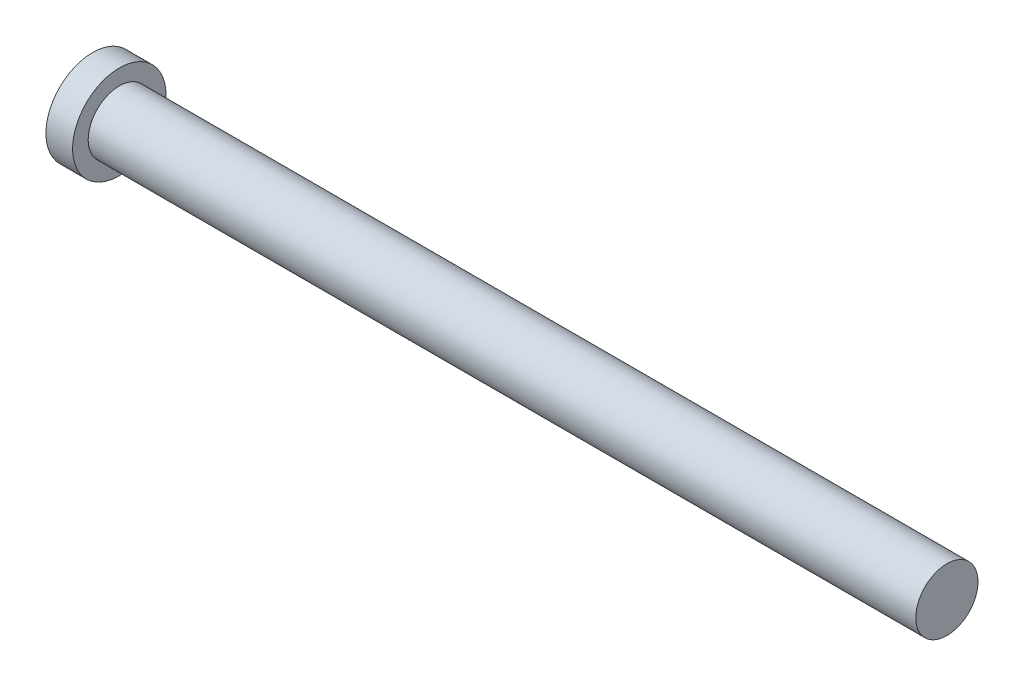
ISO-10303-21;
HEADER;
FILE_DESCRIPTION(('STEP AP214'),'2;1');
FILE_NAME('part.step','',(''),(''),'','','');
FILE_SCHEMA(('AUTOMOTIVE_DESIGN { 1 0 10303 214 1 1 1 1 }'));
ENDSEC;
DATA;
#1=APPLICATION_CONTEXT('core data for automotive mechanical design processes');
#2=APPLICATION_PROTOCOL_DEFINITION('international standard','automotive_design',2000,#1);
#3=PRODUCT_CONTEXT('',#1,'mechanical');
#4=PRODUCT('Part','Part','',(#3));
#5=PRODUCT_RELATED_PRODUCT_CATEGORY('part','',(#4));
#6=PRODUCT_DEFINITION_FORMATION('','',#4);
#7=PRODUCT_DEFINITION_CONTEXT('part definition',#1,'design');
#8=PRODUCT_DEFINITION('design','',#6,#7);
#9=PRODUCT_DEFINITION_SHAPE('','',#8);
#10=(LENGTH_UNIT() NAMED_UNIT(*) SI_UNIT(.MILLI.,.METRE.));
#11=(NAMED_UNIT(*) PLANE_ANGLE_UNIT() SI_UNIT($,.RADIAN.));
#12=(NAMED_UNIT(*) SI_UNIT($,.STERADIAN.) SOLID_ANGLE_UNIT());
#13=UNCERTAINTY_MEASURE_WITH_UNIT(LENGTH_MEASURE(1.E-05),#10,'distance_accuracy_value','');
#14=(GEOMETRIC_REPRESENTATION_CONTEXT(3) GLOBAL_UNCERTAINTY_ASSIGNED_CONTEXT((#13)) GLOBAL_UNIT_ASSIGNED_CONTEXT((#10,
#11,#12)) REPRESENTATION_CONTEXT('',''));
#15=CARTESIAN_POINT('',(0.,0.,0.));
#16=DIRECTION('',(0.,0.,1.));
#17=DIRECTION('',(1.,0.,0.));
#18=AXIS2_PLACEMENT_3D('',#15,#16,#17);
#19=CARTESIAN_POINT('',(3.,0.,0.));
#20=DIRECTION('',(1.,0.,0.));
#21=DIRECTION('',(0.,0.,-1.));
#22=AXIS2_PLACEMENT_3D('',#19,#20,#21);
#23=PLANE('',#22);
#24=CARTESIAN_POINT('',(3.,0.,0.));
#25=DIRECTION('',(1.,0.,0.));
#26=DIRECTION('',(0.,0.,-1.));
#27=AXIS2_PLACEMENT_3D('',#24,#25,#26);
#28=CIRCLE('',#27,5.25);
#29=CARTESIAN_POINT('',(3.,0.,-5.25));
#30=VERTEX_POINT('',#29);
#31=EDGE_CURVE('E10',#30,#30,#28,.T.);
#32=ORIENTED_EDGE('',*,*,#31,.T.);
#33=EDGE_LOOP('',(#32));
#34=FACE_BOUND('',#33,.T.);
#35=CARTESIAN_POINT('',(3.,0.,0.));
#36=DIRECTION('',(1.,0.,0.));
#37=DIRECTION('',(0.,0.,-1.));
#38=AXIS2_PLACEMENT_3D('',#35,#36,#37);
#39=CIRCLE('',#38,3.5);
#40=CARTESIAN_POINT('',(2.99999999999999,0.,3.5));
#41=VERTEX_POINT('',#40);
#42=EDGE_CURVE('E43',#41,#41,#39,.T.);
#43=ORIENTED_EDGE('',*,*,#42,.F.);
#44=EDGE_LOOP('',(#43));
#45=FACE_BOUND('',#44,.T.);
#46=ADVANCED_FACE('F30',(#34,#45),#23,.T.);
#47=CARTESIAN_POINT('',(3.,0.,0.));
#48=DIRECTION('',(-1.,0.,0.));
#49=DIRECTION('',(0.,0.,1.));
#50=AXIS2_PLACEMENT_3D('',#47,#48,#49);
#51=CYLINDRICAL_SURFACE('',#50,5.25);
#52=ORIENTED_EDGE('',*,*,#31,.F.);
#53=EDGE_LOOP('',(#52));
#54=FACE_BOUND('',#53,.T.);
#55=CARTESIAN_POINT('',(0.,0.,0.));
#56=DIRECTION('',(1.,0.,0.));
#57=DIRECTION('',(0.,0.,-1.));
#58=AXIS2_PLACEMENT_3D('',#55,#56,#57);
#59=CIRCLE('',#58,5.25);
#60=CARTESIAN_POINT('',(0.,0.,-5.25));
#61=VERTEX_POINT('',#60);
#62=EDGE_CURVE('E34',#61,#61,#59,.T.);
#63=ORIENTED_EDGE('',*,*,#62,.T.);
#64=EDGE_LOOP('',(#63));
#65=FACE_BOUND('',#64,.T.);
#66=ADVANCED_FACE('F32',(#54,#65),#51,.T.);
#67=CARTESIAN_POINT('',(0.,0.,0.));
#68=DIRECTION('',(1.,0.,0.));
#69=DIRECTION('',(0.,0.,-1.));
#70=AXIS2_PLACEMENT_3D('',#67,#68,#69);
#71=PLANE('',#70);
#72=ORIENTED_EDGE('',*,*,#62,.F.);
#73=EDGE_LOOP('',(#72));
#74=FACE_BOUND('',#73,.T.);
#75=ADVANCED_FACE('F54',(#74),#71,.F.);
#76=CARTESIAN_POINT('',(96.,0.,0.));
#77=DIRECTION('',(-1.,0.,0.));
#78=DIRECTION('',(0.,0.,1.));
#79=AXIS2_PLACEMENT_3D('',#76,#77,#78);
#80=CYLINDRICAL_SURFACE('',#79,3.5);
#81=CARTESIAN_POINT('',(96.,0.,0.));
#82=DIRECTION('',(1.,0.,0.));
#83=DIRECTION('',(0.,0.,-1.));
#84=AXIS2_PLACEMENT_3D('',#81,#82,#83);
#85=CIRCLE('',#84,3.5);
#86=CARTESIAN_POINT('',(96.,0.,3.5));
#87=VERTEX_POINT('',#86);
#88=EDGE_CURVE('E41',#87,#87,#85,.T.);
#89=CARTESIAN_POINT('',(96.,0.,3.5));
#90=CARTESIAN_POINT('',(95.03125,0.,3.5));
#91=CARTESIAN_POINT('',(94.0625,0.,3.5));
#92=CARTESIAN_POINT('',(92.125,0.,3.5));
#93=CARTESIAN_POINT('',(91.15625,0.,3.5));
#94=CARTESIAN_POINT('',(89.21875,0.,3.5));
#95=CARTESIAN_POINT('',(88.25,0.,3.5));
#96=CARTESIAN_POINT('',(86.3125,0.,3.5));
#97=CARTESIAN_POINT('',(85.34375,0.,3.5));
#98=CARTESIAN_POINT('',(83.40625,0.,3.5));
#99=CARTESIAN_POINT('',(82.4375,0.,3.5));
#100=CARTESIAN_POINT('',(80.5,0.,3.5));
#101=CARTESIAN_POINT('',(79.53125,0.,3.5));
#102=CARTESIAN_POINT('',(77.59375,0.,3.5));
#103=CARTESIAN_POINT('',(76.625,0.,3.5));
#104=CARTESIAN_POINT('',(74.6875,0.,3.5));
#105=CARTESIAN_POINT('',(73.71875,0.,3.5));
#106=CARTESIAN_POINT('',(71.78125,0.,3.5));
#107=CARTESIAN_POINT('',(70.8125,0.,3.5));
#108=CARTESIAN_POINT('',(68.875,0.,3.5));
#109=CARTESIAN_POINT('',(67.90625,0.,3.5));
#110=CARTESIAN_POINT('',(65.96875,0.,3.5));
#111=CARTESIAN_POINT('',(65.,0.,3.5));
#112=CARTESIAN_POINT('',(63.0625,0.,3.5));
#113=CARTESIAN_POINT('',(62.09375,0.,3.5));
#114=CARTESIAN_POINT('',(60.15625,0.,3.5));
#115=CARTESIAN_POINT('',(59.1875,0.,3.5));
#116=CARTESIAN_POINT('',(57.25,0.,3.5));
#117=CARTESIAN_POINT('',(56.28125,0.,3.5));
#118=CARTESIAN_POINT('',(54.34375,0.,3.5));
#119=CARTESIAN_POINT('',(53.375,0.,3.5));
#120=CARTESIAN_POINT('',(51.4375,0.,3.5));
#121=CARTESIAN_POINT('',(50.46875,0.,3.5));
#122=CARTESIAN_POINT('',(48.53125,0.,3.5));
#123=CARTESIAN_POINT('',(47.5625,0.,3.5));
#124=CARTESIAN_POINT('',(45.625,0.,3.5));
#125=CARTESIAN_POINT('',(44.65625,0.,3.5));
#126=CARTESIAN_POINT('',(42.71875,0.,3.5));
#127=CARTESIAN_POINT('',(41.75,0.,3.5));
#128=CARTESIAN_POINT('',(39.8125,0.,3.5));
#129=CARTESIAN_POINT('',(38.84375,0.,3.5));
#130=CARTESIAN_POINT('',(36.90625,0.,3.5));
#131=CARTESIAN_POINT('',(35.9375,0.,3.5));
#132=CARTESIAN_POINT('',(34.,0.,3.5));
#133=CARTESIAN_POINT('',(33.03125,0.,3.5));
#134=CARTESIAN_POINT('',(31.09375,0.,3.5));
#135=CARTESIAN_POINT('',(30.125,0.,3.5));
#136=CARTESIAN_POINT('',(28.1875,0.,3.5));
#137=CARTESIAN_POINT('',(27.21875,0.,3.5));
#138=CARTESIAN_POINT('',(25.28125,0.,3.5));
#139=CARTESIAN_POINT('',(24.3125,0.,3.5));
#140=CARTESIAN_POINT('',(22.375,0.,3.5));
#141=CARTESIAN_POINT('',(21.40625,0.,3.5));
#142=CARTESIAN_POINT('',(19.46875,0.,3.5));
#143=CARTESIAN_POINT('',(18.5,0.,3.5));
#144=CARTESIAN_POINT('',(16.5625,0.,3.5));
#145=CARTESIAN_POINT('',(15.59375,0.,3.5));
#146=CARTESIAN_POINT('',(13.65625,0.,3.5));
#147=CARTESIAN_POINT('',(12.6875,0.,3.5));
#148=CARTESIAN_POINT('',(10.75,0.,3.5));
#149=CARTESIAN_POINT('',(9.78124999999999,0.,3.5));
#150=CARTESIAN_POINT('',(7.84374999999999,0.,3.5));
#151=CARTESIAN_POINT('',(6.87499999999999,0.,3.5));
#152=CARTESIAN_POINT('',(4.93749999999999,0.,3.5));
#153=CARTESIAN_POINT('',(3.96874999999999,0.,3.5));
#154=CARTESIAN_POINT('',(2.99999999999999,0.,3.5));
#155=B_SPLINE_CURVE_WITH_KNOTS('',3,(#89,#90,#91,#92,#93,#94,#95,#96,#97,#98,#99,#100,#101,#102,
#103,#104,#105,#106,#107,#108,#109,#110,#111,#112,#113,#114,#115,#116,#117,#118,#119,#120,#121,
#122,#123,#124,#125,#126,#127,#128,#129,#130,#131,#132,#133,#134,#135,#136,#137,#138,#139,#140,
#141,#142,#143,#144,#145,#146,#147,#148,#149,#150,#151,#152,#153,#154),.UNSPECIFIED.,.F.,.F.,(4,
2,2,2,2,2,2,2,2,2,2,2,2,2,2,2,2,2,2,2,2,2,2,2,2,2,2,2,2,2,2,2,4),(0.,2.90625000000001,
5.81250000000001,8.71875000000001,11.625,14.53125,17.4375,20.34375,23.25,26.15625,29.0625,
31.96875,34.875,37.78125,40.6875,43.59375,46.5,49.40625,52.3125,55.21875,58.125,61.03125,
63.9375,66.84375,69.75,72.65625,75.5625,78.46875,81.375,84.28125,87.1875,90.09375,93.),.UNSPECIFIED.);
#156=EDGE_CURVE('BSEAM51',#87,#41,#155,.T.);
#157=ORIENTED_EDGE('',*,*,#88,.F.);
#158=ORIENTED_EDGE('',*,*,#42,.T.);
#159=ORIENTED_EDGE('',*,*,#156,.T.);
#160=ORIENTED_EDGE('',*,*,#156,.F.);
#161=EDGE_LOOP('',(#157,#159,#158,#160));
#162=FACE_BOUND('',#161,.T.);
#163=ADVANCED_FACE('F51',(#162),#80,.T.);
#164=CARTESIAN_POINT('',(96.,0.,0.));
#165=DIRECTION('',(1.,0.,0.));
#166=DIRECTION('',(0.,0.,-1.));
#167=AXIS2_PLACEMENT_3D('',#164,#165,#166);
#168=PLANE('',#167);
#169=ORIENTED_EDGE('',*,*,#88,.T.);
#170=EDGE_LOOP('',(#169));
#171=FACE_BOUND('',#170,.T.);
#172=ADVANCED_FACE('F49',(#171),#168,.T.);
#173=CLOSED_SHELL('',(#46,#66,#75,#163,#172));
#174=MANIFOLD_SOLID_BREP('B2',#173);
#175=ADVANCED_BREP_SHAPE_REPRESENTATION('',(#18,#174),#14);
#176=SHAPE_DEFINITION_REPRESENTATION(#9,#175);
ENDSEC;
END-ISO-10303-21;
